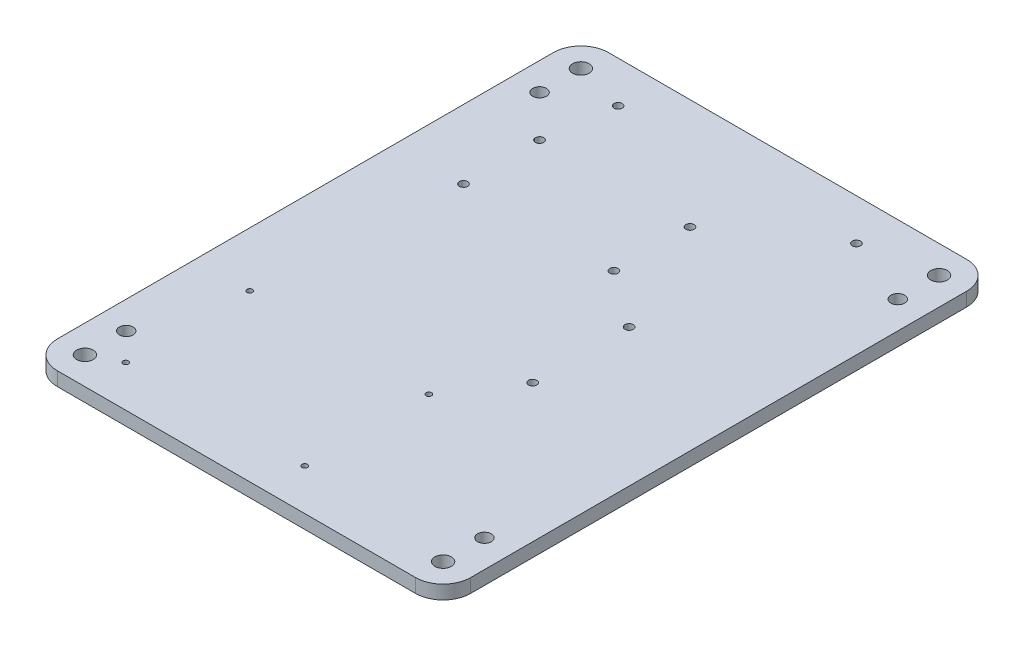
ISO-10303-21;
HEADER;
FILE_DESCRIPTION(('STEP AP214'),'2;1');
FILE_NAME('part.step','',(''),(''),'','','');
FILE_SCHEMA(('AUTOMOTIVE_DESIGN { 1 0 10303 214 1 1 1 1 }'));
ENDSEC;
DATA;
#1=APPLICATION_CONTEXT('core data for automotive mechanical design processes');
#2=APPLICATION_PROTOCOL_DEFINITION('international standard','automotive_design',2000,#1);
#3=PRODUCT_CONTEXT('',#1,'mechanical');
#4=PRODUCT('Part','Part','',(#3));
#5=PRODUCT_RELATED_PRODUCT_CATEGORY('part','',(#4));
#6=PRODUCT_DEFINITION_FORMATION('','',#4);
#7=PRODUCT_DEFINITION_CONTEXT('part definition',#1,'design');
#8=PRODUCT_DEFINITION('design','',#6,#7);
#9=PRODUCT_DEFINITION_SHAPE('','',#8);
#10=(LENGTH_UNIT() NAMED_UNIT(*) SI_UNIT(.MILLI.,.METRE.));
#11=(NAMED_UNIT(*) PLANE_ANGLE_UNIT() SI_UNIT($,.RADIAN.));
#12=(NAMED_UNIT(*) SI_UNIT($,.STERADIAN.) SOLID_ANGLE_UNIT());
#13=UNCERTAINTY_MEASURE_WITH_UNIT(LENGTH_MEASURE(1.E-05),#10,'distance_accuracy_value','');
#14=(GEOMETRIC_REPRESENTATION_CONTEXT(3) GLOBAL_UNCERTAINTY_ASSIGNED_CONTEXT((#13)) GLOBAL_UNIT_ASSIGNED_CONTEXT((#10,
#11,#12)) REPRESENTATION_CONTEXT('',''));
#15=CARTESIAN_POINT('',(0.,0.,0.));
#16=DIRECTION('',(0.,0.,1.));
#17=DIRECTION('',(1.,0.,0.));
#18=AXIS2_PLACEMENT_3D('',#15,#16,#17);
#19=CARTESIAN_POINT('',(0.,10.,0.));
#20=DIRECTION('',(-1.,0.,0.));
#21=DIRECTION('',(0.,0.,1.));
#22=AXIS2_PLACEMENT_3D('',#19,#20,#21);
#23=PLANE('',#22);
#24=DIRECTION('',(0.,0.,1.));
#25=VECTOR('',#24,1.);
#26=CARTESIAN_POINT('',(0.,10.,0.));
#27=LINE('',#26,#25);
#28=CARTESIAN_POINT('',(0.,10.,10.));
#29=VERTEX_POINT('',#28);
#30=CARTESIAN_POINT('',(0.,10.,190.));
#31=VERTEX_POINT('',#30);
#32=EDGE_CURVE('E135',#29,#31,#27,.T.);
#33=ORIENTED_EDGE('',*,*,#32,.T.);
#34=DIRECTION('',(0.,1.,0.));
#35=VECTOR('',#34,1.);
#36=CARTESIAN_POINT('',(0.,10.,190.));
#37=LINE('',#36,#35);
#38=CARTESIAN_POINT('',(0.,15.,190.));
#39=VERTEX_POINT('',#38);
#40=EDGE_CURVE('E113',#31,#39,#37,.T.);
#41=ORIENTED_EDGE('',*,*,#40,.T.);
#42=DIRECTION('',(0.,0.,1.));
#43=VECTOR('',#42,1.);
#44=CARTESIAN_POINT('',(0.,15.,0.));
#45=LINE('',#44,#43);
#46=CARTESIAN_POINT('',(0.,15.,10.));
#47=VERTEX_POINT('',#46);
#48=EDGE_CURVE('E142',#47,#39,#45,.T.);
#49=ORIENTED_EDGE('',*,*,#48,.F.);
#50=DIRECTION('',(0.,1.,0.));
#51=VECTOR('',#50,1.);
#52=CARTESIAN_POINT('',(0.,10.,10.));
#53=LINE('',#52,#51);
#54=EDGE_CURVE('E163',#29,#47,#53,.T.);
#55=ORIENTED_EDGE('',*,*,#54,.F.);
#56=EDGE_LOOP('',(#33,#41,#49,#55));
#57=FACE_BOUND('',#56,.T.);
#58=ADVANCED_FACE('F42',(#57),#23,.T.);
#59=CARTESIAN_POINT('',(0.,10.,0.));
#60=DIRECTION('',(0.,0.,-1.));
#61=DIRECTION('',(-1.,0.,0.));
#62=AXIS2_PLACEMENT_3D('',#59,#60,#61);
#63=PLANE('',#62);
#64=DIRECTION('',(-1.,0.,0.));
#65=VECTOR('',#64,1.);
#66=CARTESIAN_POINT('',(0.,10.,0.));
#67=LINE('',#66,#65);
#68=CARTESIAN_POINT('',(140.,10.,0.));
#69=VERTEX_POINT('',#68);
#70=CARTESIAN_POINT('',(10.,10.,0.));
#71=VERTEX_POINT('',#70);
#72=EDGE_CURVE('E12',#69,#71,#67,.T.);
#73=ORIENTED_EDGE('',*,*,#72,.T.);
#74=DIRECTION('',(0.,1.,0.));
#75=VECTOR('',#74,1.);
#76=CARTESIAN_POINT('',(10.,10.,0.));
#77=LINE('',#76,#75);
#78=CARTESIAN_POINT('',(10.,15.,0.));
#79=VERTEX_POINT('',#78);
#80=EDGE_CURVE('E160',#71,#79,#77,.T.);
#81=ORIENTED_EDGE('',*,*,#80,.T.);
#82=DIRECTION('',(-1.,0.,0.));
#83=VECTOR('',#82,1.);
#84=CARTESIAN_POINT('',(0.,15.,0.));
#85=LINE('',#84,#83);
#86=CARTESIAN_POINT('',(140.,15.,0.));
#87=VERTEX_POINT('',#86);
#88=EDGE_CURVE('E45',#87,#79,#85,.T.);
#89=ORIENTED_EDGE('',*,*,#88,.F.);
#90=DIRECTION('',(0.,1.,0.));
#91=VECTOR('',#90,1.);
#92=CARTESIAN_POINT('',(140.,10.,0.));
#93=LINE('',#92,#91);
#94=EDGE_CURVE('E58',#69,#87,#93,.T.);
#95=ORIENTED_EDGE('',*,*,#94,.F.);
#96=EDGE_LOOP('',(#73,#81,#89,#95));
#97=FACE_BOUND('',#96,.T.);
#98=ADVANCED_FACE('F158',(#97),#63,.T.);
#99=CARTESIAN_POINT('',(150.,10.,0.));
#100=DIRECTION('',(1.,0.,0.));
#101=DIRECTION('',(0.,0.,-1.));
#102=AXIS2_PLACEMENT_3D('',#99,#100,#101);
#103=PLANE('',#102);
#104=DIRECTION('',(0.,0.,-1.));
#105=VECTOR('',#104,1.);
#106=CARTESIAN_POINT('',(150.,10.,0.));
#107=LINE('',#106,#105);
#108=CARTESIAN_POINT('',(150.,10.,190.));
#109=VERTEX_POINT('',#108);
#110=CARTESIAN_POINT('',(150.,10.,10.));
#111=VERTEX_POINT('',#110);
#112=EDGE_CURVE('E50',#109,#111,#107,.T.);
#113=ORIENTED_EDGE('',*,*,#112,.T.);
#114=DIRECTION('',(0.,1.,0.));
#115=VECTOR('',#114,1.);
#116=CARTESIAN_POINT('',(150.,10.,10.));
#117=LINE('',#116,#115);
#118=CARTESIAN_POINT('',(150.,15.,10.));
#119=VERTEX_POINT('',#118);
#120=EDGE_CURVE('E166',#111,#119,#117,.T.);
#121=ORIENTED_EDGE('',*,*,#120,.T.);
#122=DIRECTION('',(0.,0.,-1.));
#123=VECTOR('',#122,1.);
#124=CARTESIAN_POINT('',(150.,15.,0.));
#125=LINE('',#124,#123);
#126=CARTESIAN_POINT('',(150.,15.,190.));
#127=VERTEX_POINT('',#126);
#128=EDGE_CURVE('E146',#127,#119,#125,.T.);
#129=ORIENTED_EDGE('',*,*,#128,.F.);
#130=DIRECTION('',(0.,1.,0.));
#131=VECTOR('',#130,1.);
#132=CARTESIAN_POINT('',(150.,10.,190.));
#133=LINE('',#132,#131);
#134=EDGE_CURVE('E66',#109,#127,#133,.T.);
#135=ORIENTED_EDGE('',*,*,#134,.F.);
#136=EDGE_LOOP('',(#113,#121,#129,#135));
#137=FACE_BOUND('',#136,.T.);
#138=ADVANCED_FACE('F317',(#137),#103,.T.);
#139=CARTESIAN_POINT('',(0.,10.,200.));
#140=DIRECTION('',(0.,0.,1.));
#141=DIRECTION('',(1.,0.,0.));
#142=AXIS2_PLACEMENT_3D('',#139,#140,#141);
#143=PLANE('',#142);
#144=DIRECTION('',(0.,1.,0.));
#145=VECTOR('',#144,1.);
#146=CARTESIAN_POINT('',(10.,10.,200.));
#147=LINE('',#146,#145);
#148=CARTESIAN_POINT('',(10.,10.,200.));
#149=VERTEX_POINT('',#148);
#150=CARTESIAN_POINT('',(10.,15.,200.));
#151=VERTEX_POINT('',#150);
#152=EDGE_CURVE('E110',#149,#151,#147,.T.);
#153=ORIENTED_EDGE('',*,*,#152,.F.);
#154=DIRECTION('',(1.,0.,0.));
#155=VECTOR('',#154,1.);
#156=CARTESIAN_POINT('',(0.,10.,200.));
#157=LINE('',#156,#155);
#158=CARTESIAN_POINT('',(140.,10.,200.));
#159=VERTEX_POINT('',#158);
#160=EDGE_CURVE('E126',#149,#159,#157,.T.);
#161=ORIENTED_EDGE('',*,*,#160,.T.);
#162=DIRECTION('',(0.,1.,0.));
#163=VECTOR('',#162,1.);
#164=CARTESIAN_POINT('',(140.,10.,200.));
#165=LINE('',#164,#163);
#166=CARTESIAN_POINT('',(140.,15.,200.));
#167=VERTEX_POINT('',#166);
#168=EDGE_CURVE('E129',#159,#167,#165,.T.);
#169=ORIENTED_EDGE('',*,*,#168,.T.);
#170=DIRECTION('',(1.,0.,0.));
#171=VECTOR('',#170,1.);
#172=CARTESIAN_POINT('',(0.,15.,200.));
#173=LINE('',#172,#171);
#174=EDGE_CURVE('E128',#151,#167,#173,.T.);
#175=ORIENTED_EDGE('',*,*,#174,.F.);
#176=EDGE_LOOP('',(#153,#161,#169,#175));
#177=FACE_BOUND('',#176,.T.);
#178=ADVANCED_FACE('F124',(#177),#143,.T.);
#179=CARTESIAN_POINT('',(0.,10.,0.));
#180=DIRECTION('',(0.,1.,0.));
#181=DIRECTION('',(0.,0.,1.));
#182=AXIS2_PLACEMENT_3D('',#179,#180,#181);
#183=PLANE('',#182);
#184=CARTESIAN_POINT('',(10.,10.,10.));
#185=DIRECTION('',(0.,1.,0.));
#186=DIRECTION('',(0.,0.,1.));
#187=AXIS2_PLACEMENT_3D('',#184,#185,#186);
#188=CIRCLE('',#187,3.);
#189=CARTESIAN_POINT('',(10.,10.,13.));
#190=VERTEX_POINT('',#189);
#191=EDGE_CURVE('E174',#190,#190,#188,.T.);
#192=ORIENTED_EDGE('',*,*,#191,.T.);
#193=EDGE_LOOP('',(#192));
#194=FACE_BOUND('',#193,.T.);
#195=CARTESIAN_POINT('',(10.,10.,25.));
#196=DIRECTION('',(0.,1.,0.));
#197=DIRECTION('',(0.,0.,1.));
#198=AXIS2_PLACEMENT_3D('',#195,#196,#197);
#199=CIRCLE('',#198,2.5);
#200=CARTESIAN_POINT('',(10.,10.,27.5));
#201=VERTEX_POINT('',#200);
#202=EDGE_CURVE('E181',#201,#201,#199,.T.);
#203=ORIENTED_EDGE('',*,*,#202,.T.);
#204=EDGE_LOOP('',(#203));
#205=FACE_BOUND('',#204,.T.);
#206=CARTESIAN_POINT('',(10.,10.,175.));
#207=DIRECTION('',(0.,1.,0.));
#208=DIRECTION('',(0.,0.,1.));
#209=AXIS2_PLACEMENT_3D('',#206,#207,#208);
#210=CIRCLE('',#209,2.5);
#211=CARTESIAN_POINT('',(10.,10.,177.5));
#212=VERTEX_POINT('',#211);
#213=EDGE_CURVE('E187',#212,#212,#210,.T.);
#214=ORIENTED_EDGE('',*,*,#213,.T.);
#215=EDGE_LOOP('',(#214));
#216=FACE_BOUND('',#215,.T.);
#217=CARTESIAN_POINT('',(10.,10.,190.));
#218=DIRECTION('',(0.,1.,0.));
#219=DIRECTION('',(0.,0.,1.));
#220=AXIS2_PLACEMENT_3D('',#217,#218,#219);
#221=CIRCLE('',#220,3.);
#222=CARTESIAN_POINT('',(10.,10.,193.));
#223=VERTEX_POINT('',#222);
#224=EDGE_CURVE('E193',#223,#223,#221,.T.);
#225=ORIENTED_EDGE('',*,*,#224,.T.);
#226=EDGE_LOOP('',(#225));
#227=FACE_BOUND('',#226,.T.);
#228=CARTESIAN_POINT('',(140.,10.,190.));
#229=DIRECTION('',(0.,1.,0.));
#230=DIRECTION('',(0.,0.,1.));
#231=AXIS2_PLACEMENT_3D('',#228,#229,#230);
#232=CIRCLE('',#231,2.99999999999999);
#233=CARTESIAN_POINT('',(140.,10.,193.));
#234=VERTEX_POINT('',#233);
#235=EDGE_CURVE('E199',#234,#234,#232,.T.);
#236=ORIENTED_EDGE('',*,*,#235,.T.);
#237=EDGE_LOOP('',(#236));
#238=FACE_BOUND('',#237,.T.);
#239=CARTESIAN_POINT('',(140.,10.,175.));
#240=DIRECTION('',(0.,1.,0.));
#241=DIRECTION('',(0.,0.,1.));
#242=AXIS2_PLACEMENT_3D('',#239,#240,#241);
#243=CIRCLE('',#242,2.5);
#244=CARTESIAN_POINT('',(140.,10.,177.5));
#245=VERTEX_POINT('',#244);
#246=EDGE_CURVE('E205',#245,#245,#243,.T.);
#247=ORIENTED_EDGE('',*,*,#246,.T.);
#248=EDGE_LOOP('',(#247));
#249=FACE_BOUND('',#248,.T.);
#250=CARTESIAN_POINT('',(140.,10.,10.));
#251=DIRECTION('',(0.,1.,0.));
#252=DIRECTION('',(0.,0.,1.));
#253=AXIS2_PLACEMENT_3D('',#250,#251,#252);
#254=CIRCLE('',#253,2.99999999999999);
#255=CARTESIAN_POINT('',(140.,10.,13.));
#256=VERTEX_POINT('',#255);
#257=EDGE_CURVE('E211',#256,#256,#254,.T.);
#258=ORIENTED_EDGE('',*,*,#257,.T.);
#259=EDGE_LOOP('',(#258));
#260=FACE_BOUND('',#259,.T.);
#261=CARTESIAN_POINT('',(140.,10.,25.));
#262=DIRECTION('',(0.,1.,0.));
#263=DIRECTION('',(0.,0.,1.));
#264=AXIS2_PLACEMENT_3D('',#261,#262,#263);
#265=CIRCLE('',#264,2.5);
#266=CARTESIAN_POINT('',(140.,10.,27.5));
#267=VERTEX_POINT('',#266);
#268=EDGE_CURVE('E217',#267,#267,#265,.T.);
#269=ORIENTED_EDGE('',*,*,#268,.T.);
#270=EDGE_LOOP('',(#269));
#271=FACE_BOUND('',#270,.T.);
#272=CARTESIAN_POINT('',(84.8,10.,185.));
#273=DIRECTION('',(0.,1.,0.));
#274=DIRECTION('',(0.,0.,1.));
#275=AXIS2_PLACEMENT_3D('',#272,#273,#274);
#276=CIRCLE('',#275,0.999999999999998);
#277=CARTESIAN_POINT('',(84.8,10.,186.));
#278=VERTEX_POINT('',#277);
#279=EDGE_CURVE('E223',#278,#278,#276,.T.);
#280=ORIENTED_EDGE('',*,*,#279,.T.);
#281=EDGE_LOOP('',(#280));
#282=FACE_BOUND('',#281,.T.);
#283=CARTESIAN_POINT('',(19.8000000000001,10.,185.));
#284=DIRECTION('',(0.,1.,0.));
#285=DIRECTION('',(0.,0.,1.));
#286=AXIS2_PLACEMENT_3D('',#283,#284,#285);
#287=CIRCLE('',#286,0.999999999999998);
#288=CARTESIAN_POINT('',(19.8000000000001,10.,186.));
#289=VERTEX_POINT('',#288);
#290=EDGE_CURVE('E229',#289,#289,#287,.T.);
#291=ORIENTED_EDGE('',*,*,#290,.T.);
#292=EDGE_LOOP('',(#291));
#293=FACE_BOUND('',#292,.T.);
#294=CARTESIAN_POINT('',(19.8,10.,140.));
#295=DIRECTION('',(0.,1.,0.));
#296=DIRECTION('',(0.,0.,1.));
#297=AXIS2_PLACEMENT_3D('',#294,#295,#296);
#298=CIRCLE('',#297,0.999999999999998);
#299=CARTESIAN_POINT('',(19.8,10.,141.));
#300=VERTEX_POINT('',#299);
#301=EDGE_CURVE('E235',#300,#300,#298,.T.);
#302=ORIENTED_EDGE('',*,*,#301,.T.);
#303=EDGE_LOOP('',(#302));
#304=FACE_BOUND('',#303,.T.);
#305=CARTESIAN_POINT('',(84.8,10.,140.));
#306=DIRECTION('',(0.,1.,0.));
#307=DIRECTION('',(0.,0.,1.));
#308=AXIS2_PLACEMENT_3D('',#305,#306,#307);
#309=CIRCLE('',#308,0.999999999999998);
#310=CARTESIAN_POINT('',(84.8,10.,141.));
#311=VERTEX_POINT('',#310);
#312=EDGE_CURVE('E241',#311,#311,#309,.T.);
#313=ORIENTED_EDGE('',*,*,#312,.T.);
#314=EDGE_LOOP('',(#313));
#315=FACE_BOUND('',#314,.T.);
#316=CARTESIAN_POINT('',(100.,10.,117.5));
#317=DIRECTION('',(0.,1.,0.));
#318=DIRECTION('',(0.,0.,1.));
#319=AXIS2_PLACEMENT_3D('',#316,#317,#318);
#320=CIRCLE('',#319,1.5);
#321=CARTESIAN_POINT('',(100.,10.,119.));
#322=VERTEX_POINT('',#321);
#323=EDGE_CURVE('E247',#322,#322,#320,.T.);
#324=ORIENTED_EDGE('',*,*,#323,.T.);
#325=EDGE_LOOP('',(#324));
#326=FACE_BOUND('',#325,.T.);
#327=CARTESIAN_POINT('',(100.,10.,82.5));
#328=DIRECTION('',(0.,1.,0.));
#329=DIRECTION('',(0.,0.,1.));
#330=AXIS2_PLACEMENT_3D('',#327,#328,#329);
#331=CIRCLE('',#330,1.5);
#332=CARTESIAN_POINT('',(100.,10.,84.));
#333=VERTEX_POINT('',#332);
#334=EDGE_CURVE('E253',#333,#333,#331,.T.);
#335=ORIENTED_EDGE('',*,*,#334,.T.);
#336=EDGE_LOOP('',(#335));
#337=FACE_BOUND('',#336,.T.);
#338=CARTESIAN_POINT('',(28.5,10.,15.));
#339=DIRECTION('',(0.,1.,0.));
#340=DIRECTION('',(0.,0.,1.));
#341=AXIS2_PLACEMENT_3D('',#338,#339,#340);
#342=CIRCLE('',#341,1.5);
#343=CARTESIAN_POINT('',(28.5,10.,16.5));
#344=VERTEX_POINT('',#343);
#345=EDGE_CURVE('E259',#344,#344,#342,.T.);
#346=ORIENTED_EDGE('',*,*,#345,.T.);
#347=EDGE_LOOP('',(#346));
#348=FACE_BOUND('',#347,.T.);
#349=CARTESIAN_POINT('',(115.,10.,15.));
#350=DIRECTION('',(0.,1.,0.));
#351=DIRECTION('',(0.,0.,1.));
#352=AXIS2_PLACEMENT_3D('',#349,#350,#351);
#353=CIRCLE('',#352,1.5);
#354=CARTESIAN_POINT('',(115.,10.,16.5));
#355=VERTEX_POINT('',#354);
#356=EDGE_CURVE('E265',#355,#355,#353,.T.);
#357=ORIENTED_EDGE('',*,*,#356,.T.);
#358=EDGE_LOOP('',(#357));
#359=FACE_BOUND('',#358,.T.);
#360=CARTESIAN_POINT('',(25.,10.,67.6));
#361=DIRECTION('',(0.,1.,0.));
#362=DIRECTION('',(0.,0.,1.));
#363=AXIS2_PLACEMENT_3D('',#360,#361,#362);
#364=CIRCLE('',#363,1.5);
#365=CARTESIAN_POINT('',(25.,10.,69.1));
#366=VERTEX_POINT('',#365);
#367=EDGE_CURVE('E271',#366,#366,#364,.T.);
#368=ORIENTED_EDGE('',*,*,#367,.T.);
#369=EDGE_LOOP('',(#368));
#370=FACE_BOUND('',#369,.T.);
#371=CARTESIAN_POINT('',(79.6,10.,67.6));
#372=DIRECTION('',(0.,1.,0.));
#373=DIRECTION('',(0.,0.,1.));
#374=AXIS2_PLACEMENT_3D('',#371,#372,#373);
#375=CIRCLE('',#374,1.5);
#376=CARTESIAN_POINT('',(79.6,10.,69.1));
#377=VERTEX_POINT('',#376);
#378=EDGE_CURVE('E277',#377,#377,#375,.T.);
#379=ORIENTED_EDGE('',*,*,#378,.T.);
#380=EDGE_LOOP('',(#379));
#381=FACE_BOUND('',#380,.T.);
#382=CARTESIAN_POINT('',(79.6,10.,40.));
#383=DIRECTION('',(0.,1.,0.));
#384=DIRECTION('',(0.,0.,1.));
#385=AXIS2_PLACEMENT_3D('',#382,#383,#384);
#386=CIRCLE('',#385,1.5);
#387=CARTESIAN_POINT('',(79.6,10.,41.5));
#388=VERTEX_POINT('',#387);
#389=EDGE_CURVE('E283',#388,#388,#386,.T.);
#390=ORIENTED_EDGE('',*,*,#389,.T.);
#391=EDGE_LOOP('',(#390));
#392=FACE_BOUND('',#391,.T.);
#393=CARTESIAN_POINT('',(25.,10.,40.));
#394=DIRECTION('',(0.,1.,0.));
#395=DIRECTION('',(0.,0.,1.));
#396=AXIS2_PLACEMENT_3D('',#393,#394,#395);
#397=CIRCLE('',#396,1.5);
#398=CARTESIAN_POINT('',(25.,10.,41.5));
#399=VERTEX_POINT('',#398);
#400=EDGE_CURVE('E145',#399,#399,#397,.T.);
#401=ORIENTED_EDGE('',*,*,#400,.T.);
#402=EDGE_LOOP('',(#401));
#403=FACE_BOUND('',#402,.T.);
#404=CARTESIAN_POINT('',(10.,10.,190.));
#405=DIRECTION('',(0.,1.,0.));
#406=DIRECTION('',(0.,0.,1.));
#407=AXIS2_PLACEMENT_3D('',#404,#405,#406);
#408=CIRCLE('',#407,10.);
#409=EDGE_CURVE('E107',#31,#149,#408,.T.);
#410=ORIENTED_EDGE('',*,*,#409,.F.);
#411=ORIENTED_EDGE('',*,*,#32,.F.);
#412=CARTESIAN_POINT('',(10.,10.,10.));
#413=DIRECTION('',(0.,1.,0.));
#414=DIRECTION('',(0.,0.,-1.));
#415=AXIS2_PLACEMENT_3D('',#412,#413,#414);
#416=CIRCLE('',#415,10.);
#417=EDGE_CURVE('E130',#71,#29,#416,.T.);
#418=ORIENTED_EDGE('',*,*,#417,.F.);
#419=ORIENTED_EDGE('',*,*,#72,.F.);
#420=CARTESIAN_POINT('',(140.,10.,10.));
#421=DIRECTION('',(0.,1.,0.));
#422=DIRECTION('',(0.,0.,1.));
#423=AXIS2_PLACEMENT_3D('',#420,#421,#422);
#424=CIRCLE('',#423,10.);
#425=EDGE_CURVE('E320',#111,#69,#424,.T.);
#426=ORIENTED_EDGE('',*,*,#425,.F.);
#427=ORIENTED_EDGE('',*,*,#112,.F.);
#428=CARTESIAN_POINT('',(140.,10.,190.));
#429=DIRECTION('',(0.,1.,0.));
#430=DIRECTION('',(0.,0.,-1.));
#431=AXIS2_PLACEMENT_3D('',#428,#429,#430);
#432=CIRCLE('',#431,10.);
#433=EDGE_CURVE('E118',#159,#109,#432,.T.);
#434=ORIENTED_EDGE('',*,*,#433,.F.);
#435=ORIENTED_EDGE('',*,*,#160,.F.);
#436=EDGE_LOOP('',(#410,#411,#418,#419,#426,#427,#434,#435));
#437=FACE_BOUND('',#436,.T.);
#438=ADVANCED_FACE('F133',(#194,#205,#216,#227,#238,#249,#260,#271,#282,#293,#304,#315,#326,
#337,#348,#359,#370,#381,#392,#403,#437),#183,.F.);
#439=CARTESIAN_POINT('',(0.,15.,0.));
#440=DIRECTION('',(0.,1.,0.));
#441=DIRECTION('',(0.,0.,1.));
#442=AXIS2_PLACEMENT_3D('',#439,#440,#441);
#443=PLANE('',#442);
#444=CARTESIAN_POINT('',(10.,15.,10.));
#445=DIRECTION('',(0.,1.,0.));
#446=DIRECTION('',(0.,0.,1.));
#447=AXIS2_PLACEMENT_3D('',#444,#445,#446);
#448=CIRCLE('',#447,3.);
#449=CARTESIAN_POINT('',(10.,15.,13.));
#450=VERTEX_POINT('',#449);
#451=EDGE_CURVE('E178',#450,#450,#448,.T.);
#452=ORIENTED_EDGE('',*,*,#451,.F.);
#453=EDGE_LOOP('',(#452));
#454=FACE_BOUND('',#453,.T.);
#455=CARTESIAN_POINT('',(10.,15.,25.));
#456=DIRECTION('',(0.,1.,0.));
#457=DIRECTION('',(0.,0.,1.));
#458=AXIS2_PLACEMENT_3D('',#455,#456,#457);
#459=CIRCLE('',#458,2.5);
#460=CARTESIAN_POINT('',(10.,15.,27.5));
#461=VERTEX_POINT('',#460);
#462=EDGE_CURVE('E177',#461,#461,#459,.T.);
#463=ORIENTED_EDGE('',*,*,#462,.F.);
#464=EDGE_LOOP('',(#463));
#465=FACE_BOUND('',#464,.T.);
#466=CARTESIAN_POINT('',(10.,15.,175.));
#467=DIRECTION('',(0.,1.,0.));
#468=DIRECTION('',(0.,0.,1.));
#469=AXIS2_PLACEMENT_3D('',#466,#467,#468);
#470=CIRCLE('',#469,2.5);
#471=CARTESIAN_POINT('',(10.,15.,177.5));
#472=VERTEX_POINT('',#471);
#473=EDGE_CURVE('E184',#472,#472,#470,.T.);
#474=ORIENTED_EDGE('',*,*,#473,.F.);
#475=EDGE_LOOP('',(#474));
#476=FACE_BOUND('',#475,.T.);
#477=CARTESIAN_POINT('',(10.,15.,190.));
#478=DIRECTION('',(0.,1.,0.));
#479=DIRECTION('',(0.,0.,1.));
#480=AXIS2_PLACEMENT_3D('',#477,#478,#479);
#481=CIRCLE('',#480,3.);
#482=CARTESIAN_POINT('',(10.,15.,193.));
#483=VERTEX_POINT('',#482);
#484=EDGE_CURVE('E190',#483,#483,#481,.T.);
#485=ORIENTED_EDGE('',*,*,#484,.F.);
#486=EDGE_LOOP('',(#485));
#487=FACE_BOUND('',#486,.T.);
#488=CARTESIAN_POINT('',(140.,15.,190.));
#489=DIRECTION('',(0.,1.,0.));
#490=DIRECTION('',(0.,0.,1.));
#491=AXIS2_PLACEMENT_3D('',#488,#489,#490);
#492=CIRCLE('',#491,2.99999999999999);
#493=CARTESIAN_POINT('',(140.,15.,193.));
#494=VERTEX_POINT('',#493);
#495=EDGE_CURVE('E196',#494,#494,#492,.T.);
#496=ORIENTED_EDGE('',*,*,#495,.F.);
#497=EDGE_LOOP('',(#496));
#498=FACE_BOUND('',#497,.T.);
#499=CARTESIAN_POINT('',(140.,15.,175.));
#500=DIRECTION('',(0.,1.,0.));
#501=DIRECTION('',(0.,0.,1.));
#502=AXIS2_PLACEMENT_3D('',#499,#500,#501);
#503=CIRCLE('',#502,2.5);
#504=CARTESIAN_POINT('',(140.,15.,177.5));
#505=VERTEX_POINT('',#504);
#506=EDGE_CURVE('E202',#505,#505,#503,.T.);
#507=ORIENTED_EDGE('',*,*,#506,.F.);
#508=EDGE_LOOP('',(#507));
#509=FACE_BOUND('',#508,.T.);
#510=CARTESIAN_POINT('',(140.,15.,10.));
#511=DIRECTION('',(0.,1.,0.));
#512=DIRECTION('',(0.,0.,1.));
#513=AXIS2_PLACEMENT_3D('',#510,#511,#512);
#514=CIRCLE('',#513,2.99999999999999);
#515=CARTESIAN_POINT('',(140.,15.,13.));
#516=VERTEX_POINT('',#515);
#517=EDGE_CURVE('E208',#516,#516,#514,.T.);
#518=ORIENTED_EDGE('',*,*,#517,.F.);
#519=EDGE_LOOP('',(#518));
#520=FACE_BOUND('',#519,.T.);
#521=CARTESIAN_POINT('',(140.,15.,25.));
#522=DIRECTION('',(0.,1.,0.));
#523=DIRECTION('',(0.,0.,1.));
#524=AXIS2_PLACEMENT_3D('',#521,#522,#523);
#525=CIRCLE('',#524,2.5);
#526=CARTESIAN_POINT('',(140.,15.,27.5));
#527=VERTEX_POINT('',#526);
#528=EDGE_CURVE('E214',#527,#527,#525,.T.);
#529=ORIENTED_EDGE('',*,*,#528,.F.);
#530=EDGE_LOOP('',(#529));
#531=FACE_BOUND('',#530,.T.);
#532=CARTESIAN_POINT('',(84.8,15.,185.));
#533=DIRECTION('',(0.,1.,0.));
#534=DIRECTION('',(0.,0.,1.));
#535=AXIS2_PLACEMENT_3D('',#532,#533,#534);
#536=CIRCLE('',#535,0.999999999999998);
#537=CARTESIAN_POINT('',(84.8,15.,186.));
#538=VERTEX_POINT('',#537);
#539=EDGE_CURVE('E220',#538,#538,#536,.T.);
#540=ORIENTED_EDGE('',*,*,#539,.F.);
#541=EDGE_LOOP('',(#540));
#542=FACE_BOUND('',#541,.T.);
#543=CARTESIAN_POINT('',(19.8000000000001,15.,185.));
#544=DIRECTION('',(0.,1.,0.));
#545=DIRECTION('',(0.,0.,1.));
#546=AXIS2_PLACEMENT_3D('',#543,#544,#545);
#547=CIRCLE('',#546,0.999999999999998);
#548=CARTESIAN_POINT('',(19.8000000000001,15.,186.));
#549=VERTEX_POINT('',#548);
#550=EDGE_CURVE('E226',#549,#549,#547,.T.);
#551=ORIENTED_EDGE('',*,*,#550,.F.);
#552=EDGE_LOOP('',(#551));
#553=FACE_BOUND('',#552,.T.);
#554=CARTESIAN_POINT('',(19.8,15.,140.));
#555=DIRECTION('',(0.,1.,0.));
#556=DIRECTION('',(0.,0.,1.));
#557=AXIS2_PLACEMENT_3D('',#554,#555,#556);
#558=CIRCLE('',#557,0.999999999999998);
#559=CARTESIAN_POINT('',(19.8,15.,141.));
#560=VERTEX_POINT('',#559);
#561=EDGE_CURVE('E232',#560,#560,#558,.T.);
#562=ORIENTED_EDGE('',*,*,#561,.F.);
#563=EDGE_LOOP('',(#562));
#564=FACE_BOUND('',#563,.T.);
#565=CARTESIAN_POINT('',(84.8,15.,140.));
#566=DIRECTION('',(0.,1.,0.));
#567=DIRECTION('',(0.,0.,1.));
#568=AXIS2_PLACEMENT_3D('',#565,#566,#567);
#569=CIRCLE('',#568,0.999999999999998);
#570=CARTESIAN_POINT('',(84.8,15.,141.));
#571=VERTEX_POINT('',#570);
#572=EDGE_CURVE('E238',#571,#571,#569,.T.);
#573=ORIENTED_EDGE('',*,*,#572,.F.);
#574=EDGE_LOOP('',(#573));
#575=FACE_BOUND('',#574,.T.);
#576=CARTESIAN_POINT('',(100.,15.,117.5));
#577=DIRECTION('',(0.,1.,0.));
#578=DIRECTION('',(0.,0.,1.));
#579=AXIS2_PLACEMENT_3D('',#576,#577,#578);
#580=CIRCLE('',#579,1.5);
#581=CARTESIAN_POINT('',(100.,15.,119.));
#582=VERTEX_POINT('',#581);
#583=EDGE_CURVE('E244',#582,#582,#580,.T.);
#584=ORIENTED_EDGE('',*,*,#583,.F.);
#585=EDGE_LOOP('',(#584));
#586=FACE_BOUND('',#585,.T.);
#587=CARTESIAN_POINT('',(100.,15.,82.5));
#588=DIRECTION('',(0.,1.,0.));
#589=DIRECTION('',(0.,0.,1.));
#590=AXIS2_PLACEMENT_3D('',#587,#588,#589);
#591=CIRCLE('',#590,1.5);
#592=CARTESIAN_POINT('',(100.,15.,84.));
#593=VERTEX_POINT('',#592);
#594=EDGE_CURVE('E250',#593,#593,#591,.T.);
#595=ORIENTED_EDGE('',*,*,#594,.F.);
#596=EDGE_LOOP('',(#595));
#597=FACE_BOUND('',#596,.T.);
#598=CARTESIAN_POINT('',(28.5,15.,15.));
#599=DIRECTION('',(0.,1.,0.));
#600=DIRECTION('',(0.,0.,1.));
#601=AXIS2_PLACEMENT_3D('',#598,#599,#600);
#602=CIRCLE('',#601,1.5);
#603=CARTESIAN_POINT('',(28.5,15.,16.5));
#604=VERTEX_POINT('',#603);
#605=EDGE_CURVE('E256',#604,#604,#602,.T.);
#606=ORIENTED_EDGE('',*,*,#605,.F.);
#607=EDGE_LOOP('',(#606));
#608=FACE_BOUND('',#607,.T.);
#609=CARTESIAN_POINT('',(115.,15.,15.));
#610=DIRECTION('',(0.,1.,0.));
#611=DIRECTION('',(0.,0.,1.));
#612=AXIS2_PLACEMENT_3D('',#609,#610,#611);
#613=CIRCLE('',#612,1.5);
#614=CARTESIAN_POINT('',(115.,15.,16.5));
#615=VERTEX_POINT('',#614);
#616=EDGE_CURVE('E262',#615,#615,#613,.T.);
#617=ORIENTED_EDGE('',*,*,#616,.F.);
#618=EDGE_LOOP('',(#617));
#619=FACE_BOUND('',#618,.T.);
#620=CARTESIAN_POINT('',(25.,15.,67.6));
#621=DIRECTION('',(0.,1.,0.));
#622=DIRECTION('',(0.,0.,1.));
#623=AXIS2_PLACEMENT_3D('',#620,#621,#622);
#624=CIRCLE('',#623,1.5);
#625=CARTESIAN_POINT('',(25.,15.,69.1));
#626=VERTEX_POINT('',#625);
#627=EDGE_CURVE('E268',#626,#626,#624,.T.);
#628=ORIENTED_EDGE('',*,*,#627,.F.);
#629=EDGE_LOOP('',(#628));
#630=FACE_BOUND('',#629,.T.);
#631=CARTESIAN_POINT('',(79.6,15.,67.6));
#632=DIRECTION('',(0.,1.,0.));
#633=DIRECTION('',(0.,0.,1.));
#634=AXIS2_PLACEMENT_3D('',#631,#632,#633);
#635=CIRCLE('',#634,1.5);
#636=CARTESIAN_POINT('',(79.6,15.,69.1));
#637=VERTEX_POINT('',#636);
#638=EDGE_CURVE('E274',#637,#637,#635,.T.);
#639=ORIENTED_EDGE('',*,*,#638,.F.);
#640=EDGE_LOOP('',(#639));
#641=FACE_BOUND('',#640,.T.);
#642=CARTESIAN_POINT('',(79.6,15.,40.));
#643=DIRECTION('',(0.,1.,0.));
#644=DIRECTION('',(0.,0.,1.));
#645=AXIS2_PLACEMENT_3D('',#642,#643,#644);
#646=CIRCLE('',#645,1.5);
#647=CARTESIAN_POINT('',(79.6,15.,41.5));
#648=VERTEX_POINT('',#647);
#649=EDGE_CURVE('E280',#648,#648,#646,.T.);
#650=ORIENTED_EDGE('',*,*,#649,.F.);
#651=EDGE_LOOP('',(#650));
#652=FACE_BOUND('',#651,.T.);
#653=CARTESIAN_POINT('',(25.,15.,40.));
#654=DIRECTION('',(0.,1.,0.));
#655=DIRECTION('',(0.,0.,1.));
#656=AXIS2_PLACEMENT_3D('',#653,#654,#655);
#657=CIRCLE('',#656,1.5);
#658=CARTESIAN_POINT('',(25.,15.,41.5));
#659=VERTEX_POINT('',#658);
#660=EDGE_CURVE('E286',#659,#659,#657,.T.);
#661=ORIENTED_EDGE('',*,*,#660,.F.);
#662=EDGE_LOOP('',(#661));
#663=FACE_BOUND('',#662,.T.);
#664=ORIENTED_EDGE('',*,*,#48,.T.);
#665=CARTESIAN_POINT('',(10.,15.,190.));
#666=DIRECTION('',(0.,1.,0.));
#667=DIRECTION('',(0.,0.,1.));
#668=AXIS2_PLACEMENT_3D('',#665,#666,#667);
#669=CIRCLE('',#668,10.);
#670=EDGE_CURVE('E325',#39,#151,#669,.T.);
#671=ORIENTED_EDGE('',*,*,#670,.T.);
#672=ORIENTED_EDGE('',*,*,#174,.T.);
#673=CARTESIAN_POINT('',(140.,15.,190.));
#674=DIRECTION('',(0.,1.,0.));
#675=DIRECTION('',(0.,0.,-1.));
#676=AXIS2_PLACEMENT_3D('',#673,#674,#675);
#677=CIRCLE('',#676,10.);
#678=EDGE_CURVE('E327',#167,#127,#677,.T.);
#679=ORIENTED_EDGE('',*,*,#678,.T.);
#680=ORIENTED_EDGE('',*,*,#128,.T.);
#681=CARTESIAN_POINT('',(140.,15.,10.));
#682=DIRECTION('',(0.,1.,0.));
#683=DIRECTION('',(0.,0.,1.));
#684=AXIS2_PLACEMENT_3D('',#681,#682,#683);
#685=CIRCLE('',#684,10.);
#686=EDGE_CURVE('E155',#119,#87,#685,.T.);
#687=ORIENTED_EDGE('',*,*,#686,.T.);
#688=ORIENTED_EDGE('',*,*,#88,.T.);
#689=CARTESIAN_POINT('',(10.,15.,10.));
#690=DIRECTION('',(0.,1.,0.));
#691=DIRECTION('',(0.,0.,-1.));
#692=AXIS2_PLACEMENT_3D('',#689,#690,#691);
#693=CIRCLE('',#692,10.);
#694=EDGE_CURVE('E119',#79,#47,#693,.T.);
#695=ORIENTED_EDGE('',*,*,#694,.T.);
#696=EDGE_LOOP('',(#664,#671,#672,#679,#680,#687,#688,#695));
#697=FACE_BOUND('',#696,.T.);
#698=ADVANCED_FACE('F153',(#454,#465,#476,#487,#498,#509,#520,#531,#542,#553,#564,#575,#586,
#597,#608,#619,#630,#641,#652,#663,#697),#443,.T.);
#699=CARTESIAN_POINT('',(25.,10.,40.));
#700=DIRECTION('',(0.,1.,0.));
#701=DIRECTION('',(0.,0.,1.));
#702=AXIS2_PLACEMENT_3D('',#699,#700,#701);
#703=CYLINDRICAL_SURFACE('',#702,1.5);
#704=ORIENTED_EDGE('',*,*,#400,.F.);
#705=EDGE_LOOP('',(#704));
#706=FACE_BOUND('',#705,.T.);
#707=ORIENTED_EDGE('',*,*,#660,.T.);
#708=EDGE_LOOP('',(#707));
#709=FACE_BOUND('',#708,.T.);
#710=ADVANCED_FACE('F293',(#706,#709),#703,.F.);
#711=CARTESIAN_POINT('',(79.6,10.,40.));
#712=DIRECTION('',(0.,1.,0.));
#713=DIRECTION('',(0.,0.,1.));
#714=AXIS2_PLACEMENT_3D('',#711,#712,#713);
#715=CYLINDRICAL_SURFACE('',#714,1.5);
#716=ORIENTED_EDGE('',*,*,#389,.F.);
#717=EDGE_LOOP('',(#716));
#718=FACE_BOUND('',#717,.T.);
#719=ORIENTED_EDGE('',*,*,#649,.T.);
#720=EDGE_LOOP('',(#719));
#721=FACE_BOUND('',#720,.T.);
#722=ADVANCED_FACE('F303',(#718,#721),#715,.F.);
#723=CARTESIAN_POINT('',(79.6,10.,67.6));
#724=DIRECTION('',(0.,1.,0.));
#725=DIRECTION('',(0.,0.,1.));
#726=AXIS2_PLACEMENT_3D('',#723,#724,#725);
#727=CYLINDRICAL_SURFACE('',#726,1.5);
#728=ORIENTED_EDGE('',*,*,#378,.F.);
#729=EDGE_LOOP('',(#728));
#730=FACE_BOUND('',#729,.T.);
#731=ORIENTED_EDGE('',*,*,#638,.T.);
#732=EDGE_LOOP('',(#731));
#733=FACE_BOUND('',#732,.T.);
#734=ADVANCED_FACE('F410',(#730,#733),#727,.F.);
#735=CARTESIAN_POINT('',(25.,10.,67.6));
#736=DIRECTION('',(0.,1.,0.));
#737=DIRECTION('',(0.,0.,1.));
#738=AXIS2_PLACEMENT_3D('',#735,#736,#737);
#739=CYLINDRICAL_SURFACE('',#738,1.5);
#740=ORIENTED_EDGE('',*,*,#367,.F.);
#741=EDGE_LOOP('',(#740));
#742=FACE_BOUND('',#741,.T.);
#743=ORIENTED_EDGE('',*,*,#627,.T.);
#744=EDGE_LOOP('',(#743));
#745=FACE_BOUND('',#744,.T.);
#746=ADVANCED_FACE('F406',(#742,#745),#739,.F.);
#747=CARTESIAN_POINT('',(115.,10.,15.));
#748=DIRECTION('',(0.,1.,0.));
#749=DIRECTION('',(0.,0.,1.));
#750=AXIS2_PLACEMENT_3D('',#747,#748,#749);
#751=CYLINDRICAL_SURFACE('',#750,1.5);
#752=ORIENTED_EDGE('',*,*,#356,.F.);
#753=EDGE_LOOP('',(#752));
#754=FACE_BOUND('',#753,.T.);
#755=ORIENTED_EDGE('',*,*,#616,.T.);
#756=EDGE_LOOP('',(#755));
#757=FACE_BOUND('',#756,.T.);
#758=ADVANCED_FACE('F402',(#754,#757),#751,.F.);
#759=CARTESIAN_POINT('',(28.5,10.,15.));
#760=DIRECTION('',(0.,1.,0.));
#761=DIRECTION('',(0.,0.,1.));
#762=AXIS2_PLACEMENT_3D('',#759,#760,#761);
#763=CYLINDRICAL_SURFACE('',#762,1.5);
#764=ORIENTED_EDGE('',*,*,#345,.F.);
#765=EDGE_LOOP('',(#764));
#766=FACE_BOUND('',#765,.T.);
#767=ORIENTED_EDGE('',*,*,#605,.T.);
#768=EDGE_LOOP('',(#767));
#769=FACE_BOUND('',#768,.T.);
#770=ADVANCED_FACE('F398',(#766,#769),#763,.F.);
#771=CARTESIAN_POINT('',(100.,10.,82.5));
#772=DIRECTION('',(0.,1.,0.));
#773=DIRECTION('',(0.,0.,1.));
#774=AXIS2_PLACEMENT_3D('',#771,#772,#773);
#775=CYLINDRICAL_SURFACE('',#774,1.5);
#776=ORIENTED_EDGE('',*,*,#334,.F.);
#777=EDGE_LOOP('',(#776));
#778=FACE_BOUND('',#777,.T.);
#779=ORIENTED_EDGE('',*,*,#594,.T.);
#780=EDGE_LOOP('',(#779));
#781=FACE_BOUND('',#780,.T.);
#782=ADVANCED_FACE('F394',(#778,#781),#775,.F.);
#783=CARTESIAN_POINT('',(100.,10.,117.5));
#784=DIRECTION('',(0.,1.,0.));
#785=DIRECTION('',(0.,0.,1.));
#786=AXIS2_PLACEMENT_3D('',#783,#784,#785);
#787=CYLINDRICAL_SURFACE('',#786,1.5);
#788=ORIENTED_EDGE('',*,*,#323,.F.);
#789=EDGE_LOOP('',(#788));
#790=FACE_BOUND('',#789,.T.);
#791=ORIENTED_EDGE('',*,*,#583,.T.);
#792=EDGE_LOOP('',(#791));
#793=FACE_BOUND('',#792,.T.);
#794=ADVANCED_FACE('F390',(#790,#793),#787,.F.);
#795=CARTESIAN_POINT('',(84.8,10.,140.));
#796=DIRECTION('',(0.,1.,0.));
#797=DIRECTION('',(0.,0.,1.));
#798=AXIS2_PLACEMENT_3D('',#795,#796,#797);
#799=CYLINDRICAL_SURFACE('',#798,0.999999999999998);
#800=ORIENTED_EDGE('',*,*,#312,.F.);
#801=EDGE_LOOP('',(#800));
#802=FACE_BOUND('',#801,.T.);
#803=ORIENTED_EDGE('',*,*,#572,.T.);
#804=EDGE_LOOP('',(#803));
#805=FACE_BOUND('',#804,.T.);
#806=ADVANCED_FACE('F386',(#802,#805),#799,.F.);
#807=CARTESIAN_POINT('',(19.8,10.,140.));
#808=DIRECTION('',(0.,1.,0.));
#809=DIRECTION('',(0.,0.,1.));
#810=AXIS2_PLACEMENT_3D('',#807,#808,#809);
#811=CYLINDRICAL_SURFACE('',#810,0.999999999999998);
#812=ORIENTED_EDGE('',*,*,#301,.F.);
#813=EDGE_LOOP('',(#812));
#814=FACE_BOUND('',#813,.T.);
#815=ORIENTED_EDGE('',*,*,#561,.T.);
#816=EDGE_LOOP('',(#815));
#817=FACE_BOUND('',#816,.T.);
#818=ADVANCED_FACE('F382',(#814,#817),#811,.F.);
#819=CARTESIAN_POINT('',(19.8000000000001,10.,185.));
#820=DIRECTION('',(0.,1.,0.));
#821=DIRECTION('',(0.,0.,1.));
#822=AXIS2_PLACEMENT_3D('',#819,#820,#821);
#823=CYLINDRICAL_SURFACE('',#822,0.999999999999998);
#824=ORIENTED_EDGE('',*,*,#290,.F.);
#825=EDGE_LOOP('',(#824));
#826=FACE_BOUND('',#825,.T.);
#827=ORIENTED_EDGE('',*,*,#550,.T.);
#828=EDGE_LOOP('',(#827));
#829=FACE_BOUND('',#828,.T.);
#830=ADVANCED_FACE('F378',(#826,#829),#823,.F.);
#831=CARTESIAN_POINT('',(84.8,10.,185.));
#832=DIRECTION('',(0.,1.,0.));
#833=DIRECTION('',(0.,0.,1.));
#834=AXIS2_PLACEMENT_3D('',#831,#832,#833);
#835=CYLINDRICAL_SURFACE('',#834,0.999999999999998);
#836=ORIENTED_EDGE('',*,*,#279,.F.);
#837=EDGE_LOOP('',(#836));
#838=FACE_BOUND('',#837,.T.);
#839=ORIENTED_EDGE('',*,*,#539,.T.);
#840=EDGE_LOOP('',(#839));
#841=FACE_BOUND('',#840,.T.);
#842=ADVANCED_FACE('F374',(#838,#841),#835,.F.);
#843=CARTESIAN_POINT('',(140.,10.,25.));
#844=DIRECTION('',(0.,1.,0.));
#845=DIRECTION('',(0.,0.,1.));
#846=AXIS2_PLACEMENT_3D('',#843,#844,#845);
#847=CYLINDRICAL_SURFACE('',#846,2.5);
#848=ORIENTED_EDGE('',*,*,#268,.F.);
#849=EDGE_LOOP('',(#848));
#850=FACE_BOUND('',#849,.T.);
#851=ORIENTED_EDGE('',*,*,#528,.T.);
#852=EDGE_LOOP('',(#851));
#853=FACE_BOUND('',#852,.T.);
#854=ADVANCED_FACE('F370',(#850,#853),#847,.F.);
#855=CARTESIAN_POINT('',(140.,10.,10.));
#856=DIRECTION('',(0.,1.,0.));
#857=DIRECTION('',(0.,0.,1.));
#858=AXIS2_PLACEMENT_3D('',#855,#856,#857);
#859=CYLINDRICAL_SURFACE('',#858,2.99999999999999);
#860=ORIENTED_EDGE('',*,*,#257,.F.);
#861=EDGE_LOOP('',(#860));
#862=FACE_BOUND('',#861,.T.);
#863=ORIENTED_EDGE('',*,*,#517,.T.);
#864=EDGE_LOOP('',(#863));
#865=FACE_BOUND('',#864,.T.);
#866=ADVANCED_FACE('F366',(#862,#865),#859,.F.);
#867=CARTESIAN_POINT('',(140.,10.,175.));
#868=DIRECTION('',(0.,1.,0.));
#869=DIRECTION('',(0.,0.,1.));
#870=AXIS2_PLACEMENT_3D('',#867,#868,#869);
#871=CYLINDRICAL_SURFACE('',#870,2.5);
#872=ORIENTED_EDGE('',*,*,#246,.F.);
#873=EDGE_LOOP('',(#872));
#874=FACE_BOUND('',#873,.T.);
#875=ORIENTED_EDGE('',*,*,#506,.T.);
#876=EDGE_LOOP('',(#875));
#877=FACE_BOUND('',#876,.T.);
#878=ADVANCED_FACE('F362',(#874,#877),#871,.F.);
#879=CARTESIAN_POINT('',(140.,10.,190.));
#880=DIRECTION('',(0.,1.,0.));
#881=DIRECTION('',(0.,0.,1.));
#882=AXIS2_PLACEMENT_3D('',#879,#880,#881);
#883=CYLINDRICAL_SURFACE('',#882,2.99999999999999);
#884=ORIENTED_EDGE('',*,*,#235,.F.);
#885=EDGE_LOOP('',(#884));
#886=FACE_BOUND('',#885,.T.);
#887=ORIENTED_EDGE('',*,*,#495,.T.);
#888=EDGE_LOOP('',(#887));
#889=FACE_BOUND('',#888,.T.);
#890=ADVANCED_FACE('F358',(#886,#889),#883,.F.);
#891=CARTESIAN_POINT('',(10.,10.,190.));
#892=DIRECTION('',(0.,1.,0.));
#893=DIRECTION('',(0.,0.,1.));
#894=AXIS2_PLACEMENT_3D('',#891,#892,#893);
#895=CYLINDRICAL_SURFACE('',#894,3.);
#896=ORIENTED_EDGE('',*,*,#224,.F.);
#897=EDGE_LOOP('',(#896));
#898=FACE_BOUND('',#897,.T.);
#899=ORIENTED_EDGE('',*,*,#484,.T.);
#900=EDGE_LOOP('',(#899));
#901=FACE_BOUND('',#900,.T.);
#902=ADVANCED_FACE('F354',(#898,#901),#895,.F.);
#903=CARTESIAN_POINT('',(10.,10.,175.));
#904=DIRECTION('',(0.,1.,0.));
#905=DIRECTION('',(0.,0.,1.));
#906=AXIS2_PLACEMENT_3D('',#903,#904,#905);
#907=CYLINDRICAL_SURFACE('',#906,2.5);
#908=ORIENTED_EDGE('',*,*,#213,.F.);
#909=EDGE_LOOP('',(#908));
#910=FACE_BOUND('',#909,.T.);
#911=ORIENTED_EDGE('',*,*,#473,.T.);
#912=EDGE_LOOP('',(#911));
#913=FACE_BOUND('',#912,.T.);
#914=ADVANCED_FACE('F350',(#910,#913),#907,.F.);
#915=CARTESIAN_POINT('',(10.,10.,25.));
#916=DIRECTION('',(0.,1.,0.));
#917=DIRECTION('',(0.,0.,1.));
#918=AXIS2_PLACEMENT_3D('',#915,#916,#917);
#919=CYLINDRICAL_SURFACE('',#918,2.5);
#920=ORIENTED_EDGE('',*,*,#202,.F.);
#921=EDGE_LOOP('',(#920));
#922=FACE_BOUND('',#921,.T.);
#923=ORIENTED_EDGE('',*,*,#462,.T.);
#924=EDGE_LOOP('',(#923));
#925=FACE_BOUND('',#924,.T.);
#926=ADVANCED_FACE('F346',(#922,#925),#919,.F.);
#927=CARTESIAN_POINT('',(10.,10.,10.));
#928=DIRECTION('',(0.,1.,0.));
#929=DIRECTION('',(0.,0.,1.));
#930=AXIS2_PLACEMENT_3D('',#927,#928,#929);
#931=CYLINDRICAL_SURFACE('',#930,3.);
#932=ORIENTED_EDGE('',*,*,#191,.F.);
#933=EDGE_LOOP('',(#932));
#934=FACE_BOUND('',#933,.T.);
#935=ORIENTED_EDGE('',*,*,#451,.T.);
#936=EDGE_LOOP('',(#935));
#937=FACE_BOUND('',#936,.T.);
#938=ADVANCED_FACE('F340',(#934,#937),#931,.F.);
#939=CARTESIAN_POINT('',(140.,10.,190.));
#940=DIRECTION('',(0.,1.,0.));
#941=DIRECTION('',(0.,0.,1.));
#942=AXIS2_PLACEMENT_3D('',#939,#940,#941);
#943=CYLINDRICAL_SURFACE('',#942,10.);
#944=ORIENTED_EDGE('',*,*,#678,.F.);
#945=ORIENTED_EDGE('',*,*,#168,.F.);
#946=ORIENTED_EDGE('',*,*,#433,.T.);
#947=ORIENTED_EDGE('',*,*,#134,.T.);
#948=EDGE_LOOP('',(#944,#945,#946,#947));
#949=FACE_BOUND('',#948,.T.);
#950=ADVANCED_FACE('F334',(#949),#943,.T.);
#951=CARTESIAN_POINT('',(140.,10.,10.));
#952=DIRECTION('',(0.,1.,0.));
#953=DIRECTION('',(0.,0.,1.));
#954=AXIS2_PLACEMENT_3D('',#951,#952,#953);
#955=CYLINDRICAL_SURFACE('',#954,10.);
#956=ORIENTED_EDGE('',*,*,#686,.F.);
#957=ORIENTED_EDGE('',*,*,#120,.F.);
#958=ORIENTED_EDGE('',*,*,#425,.T.);
#959=ORIENTED_EDGE('',*,*,#94,.T.);
#960=EDGE_LOOP('',(#956,#957,#958,#959));
#961=FACE_BOUND('',#960,.T.);
#962=ADVANCED_FACE('F331',(#961),#955,.T.);
#963=CARTESIAN_POINT('',(10.,10.,10.));
#964=DIRECTION('',(0.,1.,0.));
#965=DIRECTION('',(0.,0.,1.));
#966=AXIS2_PLACEMENT_3D('',#963,#964,#965);
#967=CYLINDRICAL_SURFACE('',#966,10.);
#968=ORIENTED_EDGE('',*,*,#694,.F.);
#969=ORIENTED_EDGE('',*,*,#80,.F.);
#970=ORIENTED_EDGE('',*,*,#417,.T.);
#971=ORIENTED_EDGE('',*,*,#54,.T.);
#972=EDGE_LOOP('',(#968,#969,#970,#971));
#973=FACE_BOUND('',#972,.T.);
#974=ADVANCED_FACE('F333',(#973),#967,.T.);
#975=CARTESIAN_POINT('',(10.,10.,190.));
#976=DIRECTION('',(0.,1.,0.));
#977=DIRECTION('',(0.,0.,1.));
#978=AXIS2_PLACEMENT_3D('',#975,#976,#977);
#979=CYLINDRICAL_SURFACE('',#978,10.);
#980=ORIENTED_EDGE('',*,*,#670,.F.);
#981=ORIENTED_EDGE('',*,*,#40,.F.);
#982=ORIENTED_EDGE('',*,*,#409,.T.);
#983=ORIENTED_EDGE('',*,*,#152,.T.);
#984=EDGE_LOOP('',(#980,#981,#982,#983));
#985=FACE_BOUND('',#984,.T.);
#986=ADVANCED_FACE('F109',(#985),#979,.T.);
#987=CLOSED_SHELL('',(#58,#98,#138,#178,#438,#698,#710,#722,#734,#746,#758,#770,#782,#794,#806,
#818,#830,#842,#854,#866,#878,#890,#902,#914,#926,#938,#950,#962,#974,#986));
#988=MANIFOLD_SOLID_BREP('B2',#987);
#989=ADVANCED_BREP_SHAPE_REPRESENTATION('',(#18,#988),#14);
#990=SHAPE_DEFINITION_REPRESENTATION(#9,#989);
ENDSEC;
END-ISO-10303-21;
